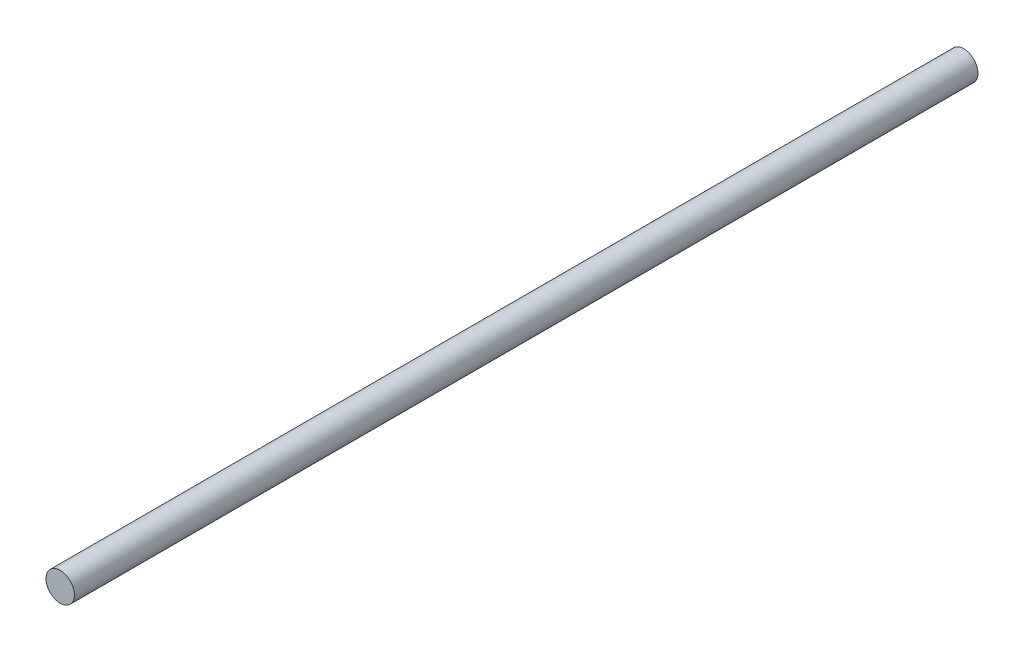
ISO-10303-21;
HEADER;
FILE_DESCRIPTION(('STEP AP214'),'2;1');
FILE_NAME('part.step','',(''),(''),'','','');
FILE_SCHEMA(('AUTOMOTIVE_DESIGN { 1 0 10303 214 1 1 1 1 }'));
ENDSEC;
DATA;
#1=APPLICATION_CONTEXT('core data for automotive mechanical design processes');
#2=APPLICATION_PROTOCOL_DEFINITION('international standard','automotive_design',2000,#1);
#3=PRODUCT_CONTEXT('',#1,'mechanical');
#4=PRODUCT('Part','Part','',(#3));
#5=PRODUCT_RELATED_PRODUCT_CATEGORY('part','',(#4));
#6=PRODUCT_DEFINITION_FORMATION('','',#4);
#7=PRODUCT_DEFINITION_CONTEXT('part definition',#1,'design');
#8=PRODUCT_DEFINITION('design','',#6,#7);
#9=PRODUCT_DEFINITION_SHAPE('','',#8);
#10=(LENGTH_UNIT() NAMED_UNIT(*) SI_UNIT(.MILLI.,.METRE.));
#11=(NAMED_UNIT(*) PLANE_ANGLE_UNIT() SI_UNIT($,.RADIAN.));
#12=(NAMED_UNIT(*) SI_UNIT($,.STERADIAN.) SOLID_ANGLE_UNIT());
#13=UNCERTAINTY_MEASURE_WITH_UNIT(LENGTH_MEASURE(1.E-05),#10,'distance_accuracy_value','');
#14=(GEOMETRIC_REPRESENTATION_CONTEXT(3) GLOBAL_UNCERTAINTY_ASSIGNED_CONTEXT((#13)) GLOBAL_UNIT_ASSIGNED_CONTEXT((#10,
#11,#12)) REPRESENTATION_CONTEXT('',''));
#15=CARTESIAN_POINT('',(0.,0.,0.));
#16=DIRECTION('',(0.,0.,1.));
#17=DIRECTION('',(1.,0.,0.));
#18=AXIS2_PLACEMENT_3D('',#15,#16,#17);
#19=CARTESIAN_POINT('',(0.,0.,-201.422));
#20=DIRECTION('',(0.,0.,1.));
#21=DIRECTION('',(1.,0.,0.));
#22=AXIS2_PLACEMENT_3D('',#19,#20,#21);
#23=CYLINDRICAL_SURFACE('',#22,3.175);
#24=CARTESIAN_POINT('',(0.,0.,-201.422));
#25=DIRECTION('',(0.,0.,1.));
#26=DIRECTION('',(1.,0.,0.));
#27=AXIS2_PLACEMENT_3D('',#24,#25,#26);
#28=CIRCLE('',#27,3.175);
#29=CARTESIAN_POINT('',(3.175,0.,-201.422));
#30=VERTEX_POINT('',#29);
#31=EDGE_CURVE('E10',#30,#30,#28,.T.);
#32=ORIENTED_EDGE('',*,*,#31,.T.);
#33=EDGE_LOOP('',(#32));
#34=FACE_BOUND('',#33,.T.);
#35=CARTESIAN_POINT('',(0.,0.,0.));
#36=DIRECTION('',(0.,0.,1.));
#37=DIRECTION('',(1.,0.,0.));
#38=AXIS2_PLACEMENT_3D('',#35,#36,#37);
#39=CIRCLE('',#38,3.175);
#40=CARTESIAN_POINT('',(3.175,0.,0.));
#41=VERTEX_POINT('',#40);
#42=EDGE_CURVE('E46',#41,#41,#39,.T.);
#43=ORIENTED_EDGE('',*,*,#42,.F.);
#44=EDGE_LOOP('',(#43));
#45=FACE_BOUND('',#44,.T.);
#46=ADVANCED_FACE('F43',(#34,#45),#23,.T.);
#47=CARTESIAN_POINT('',(0.,0.,-201.422));
#48=DIRECTION('',(0.,0.,1.));
#49=DIRECTION('',(1.,0.,0.));
#50=AXIS2_PLACEMENT_3D('',#47,#48,#49);
#51=PLANE('',#50);
#52=ORIENTED_EDGE('',*,*,#31,.F.);
#53=EDGE_LOOP('',(#52));
#54=FACE_BOUND('',#53,.T.);
#55=ADVANCED_FACE('F60',(#54),#51,.F.);
#56=CARTESIAN_POINT('',(0.,0.,0.));
#57=DIRECTION('',(0.,0.,1.));
#58=DIRECTION('',(1.,0.,0.));
#59=AXIS2_PLACEMENT_3D('',#56,#57,#58);
#60=PLANE('',#59);
#61=ORIENTED_EDGE('',*,*,#42,.T.);
#62=EDGE_LOOP('',(#61));
#63=FACE_BOUND('',#62,.T.);
#64=ADVANCED_FACE('F57',(#63),#60,.T.);
#65=CLOSED_SHELL('',(#46,#55,#64));
#66=MANIFOLD_SOLID_BREP('B2',#65);
#67=ADVANCED_BREP_SHAPE_REPRESENTATION('',(#18,#66),#14);
#68=SHAPE_DEFINITION_REPRESENTATION(#9,#67);
ENDSEC;
END-ISO-10303-21;
